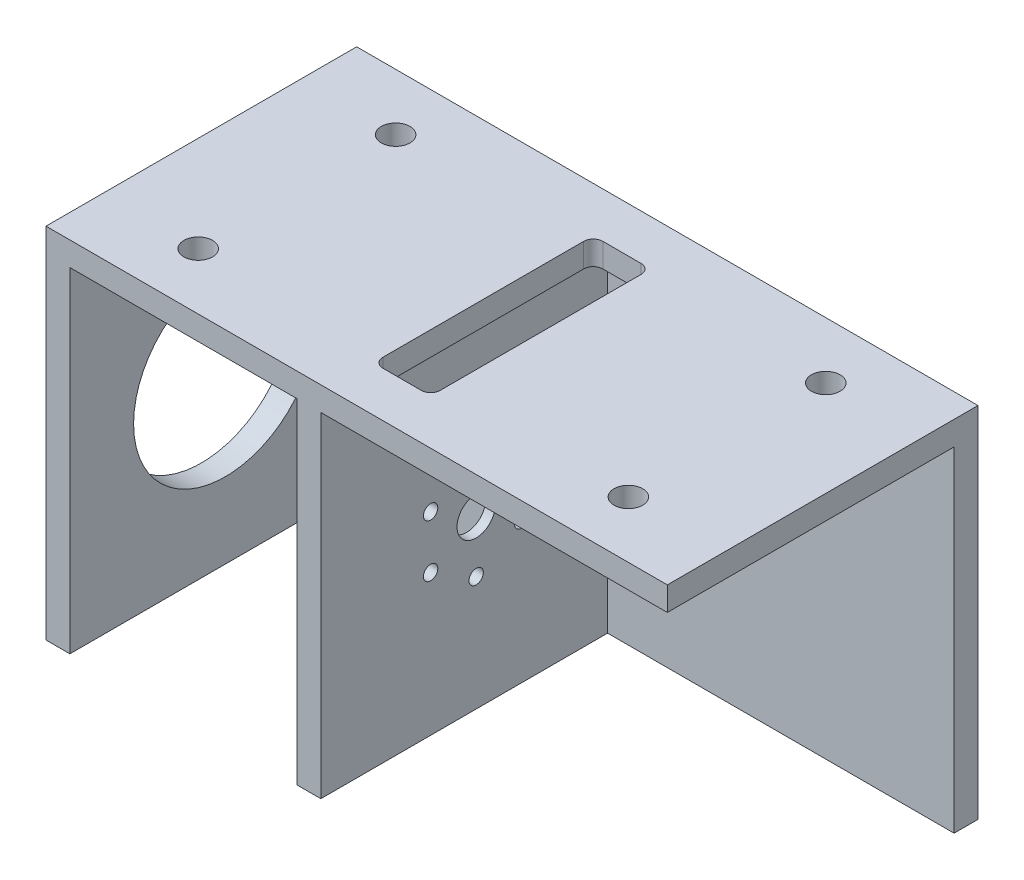
ISO-10303-21;
HEADER;
FILE_DESCRIPTION(('STEP AP214'),'2;1');
FILE_NAME('part.step','',(''),(''),'','','');
FILE_SCHEMA(('AUTOMOTIVE_DESIGN { 1 0 10303 214 1 1 1 1 }'));
ENDSEC;
DATA;
#1=APPLICATION_CONTEXT('core data for automotive mechanical design processes');
#2=APPLICATION_PROTOCOL_DEFINITION('international standard','automotive_design',2000,#1);
#3=PRODUCT_CONTEXT('',#1,'mechanical');
#4=PRODUCT('Part','Part','',(#3));
#5=PRODUCT_RELATED_PRODUCT_CATEGORY('part','',(#4));
#6=PRODUCT_DEFINITION_FORMATION('','',#4);
#7=PRODUCT_DEFINITION_CONTEXT('part definition',#1,'design');
#8=PRODUCT_DEFINITION('design','',#6,#7);
#9=PRODUCT_DEFINITION_SHAPE('','',#8);
#10=(LENGTH_UNIT() NAMED_UNIT(*) SI_UNIT(.MILLI.,.METRE.));
#11=(NAMED_UNIT(*) PLANE_ANGLE_UNIT() SI_UNIT($,.RADIAN.));
#12=(NAMED_UNIT(*) SI_UNIT($,.STERADIAN.) SOLID_ANGLE_UNIT());
#13=UNCERTAINTY_MEASURE_WITH_UNIT(LENGTH_MEASURE(1.E-05),#10,'distance_accuracy_value','');
#14=(GEOMETRIC_REPRESENTATION_CONTEXT(3) GLOBAL_UNCERTAINTY_ASSIGNED_CONTEXT((#13)) GLOBAL_UNIT_ASSIGNED_CONTEXT((#10,
#11,#12)) REPRESENTATION_CONTEXT('',''));
#15=CARTESIAN_POINT('',(0.,0.,0.));
#16=DIRECTION('',(0.,0.,1.));
#17=DIRECTION('',(1.,0.,0.));
#18=AXIS2_PLACEMENT_3D('',#15,#16,#17);
#19=CARTESIAN_POINT('',(0.,0.,0.));
#20=DIRECTION('',(0.,-1.,0.));
#21=DIRECTION('',(0.,0.,-1.));
#22=AXIS2_PLACEMENT_3D('',#19,#20,#21);
#23=PLANE('',#22);
#24=CARTESIAN_POINT('',(-45.,0.,-20.65));
#25=DIRECTION('',(0.,1.,0.));
#26=DIRECTION('',(0.,0.,1.));
#27=AXIS2_PLACEMENT_3D('',#24,#25,#26);
#28=CIRCLE('',#27,3.);
#29=CARTESIAN_POINT('',(-45.,0.,-17.65));
#30=VERTEX_POINT('',#29);
#31=EDGE_CURVE('E282',#30,#30,#28,.T.);
#32=ORIENTED_EDGE('',*,*,#31,.T.);
#33=EDGE_LOOP('',(#32));
#34=FACE_BOUND('',#33,.T.);
#35=CARTESIAN_POINT('',(-45.,0.,20.65));
#36=DIRECTION('',(0.,1.,0.));
#37=DIRECTION('',(0.,0.,-1.));
#38=AXIS2_PLACEMENT_3D('',#35,#36,#37);
#39=CIRCLE('',#38,2.99999999999999);
#40=CARTESIAN_POINT('',(-45.,0.,17.65));
#41=VERTEX_POINT('',#40);
#42=EDGE_CURVE('E274',#41,#41,#39,.T.);
#43=ORIENTED_EDGE('',*,*,#42,.T.);
#44=EDGE_LOOP('',(#43));
#45=FACE_BOUND('',#44,.T.);
#46=DIRECTION('',(1.,0.,0.));
#47=VECTOR('',#46,1.);
#48=CARTESIAN_POINT('',(65.,0.,32.5));
#49=LINE('',#48,#47);
#50=CARTESIAN_POINT('',(-60.,0.,32.5));
#51=VERTEX_POINT('',#50);
#52=CARTESIAN_POINT('',(-12.5,0.,32.5));
#53=VERTEX_POINT('',#52);
#54=EDGE_CURVE('E299',#51,#53,#49,.T.);
#55=ORIENTED_EDGE('',*,*,#54,.F.);
#56=DIRECTION('',(0.,0.,-1.));
#57=VECTOR('',#56,1.);
#58=CARTESIAN_POINT('',(-60.,0.,102.678344238091));
#59=LINE('',#58,#57);
#60=CARTESIAN_POINT('',(-60.,0.,-27.5));
#61=VERTEX_POINT('',#60);
#62=EDGE_CURVE('E192',#51,#61,#59,.T.);
#63=ORIENTED_EDGE('',*,*,#62,.T.);
#64=DIRECTION('',(-1.,0.,0.));
#65=VECTOR('',#64,1.);
#66=CARTESIAN_POINT('',(-65.,0.,-27.5));
#67=LINE('',#66,#65);
#68=CARTESIAN_POINT('',(-12.5,0.,-27.5));
#69=VERTEX_POINT('',#68);
#70=EDGE_CURVE('E200',#69,#61,#67,.T.);
#71=ORIENTED_EDGE('',*,*,#70,.F.);
#72=DIRECTION('',(0.,0.,-1.));
#73=VECTOR('',#72,1.);
#74=CARTESIAN_POINT('',(-12.5,0.,102.678344238091));
#75=LINE('',#74,#73);
#76=EDGE_CURVE('E420',#53,#69,#75,.T.);
#77=ORIENTED_EDGE('',*,*,#76,.F.);
#78=EDGE_LOOP('',(#55,#63,#71,#77));
#79=FACE_BOUND('',#78,.T.);
#80=ADVANCED_FACE('F45',(#34,#45,#79),#23,.T.);
#81=CARTESIAN_POINT('',(-65.,-70.,-27.5));
#82=DIRECTION('',(0.,0.,-1.));
#83=DIRECTION('',(-1.,0.,0.));
#84=AXIS2_PLACEMENT_3D('',#81,#82,#83);
#85=PLANE('',#84);
#86=DIRECTION('',(0.,1.,0.));
#87=VECTOR('',#86,1.);
#88=CARTESIAN_POINT('',(-60.,0.,-27.5));
#89=LINE('',#88,#87);
#90=CARTESIAN_POINT('',(-60.,-70.,-27.5));
#91=VERTEX_POINT('',#90);
#92=EDGE_CURVE('E185',#91,#61,#89,.T.);
#93=ORIENTED_EDGE('',*,*,#92,.F.);
#94=DIRECTION('',(-1.,0.,0.));
#95=VECTOR('',#94,1.);
#96=CARTESIAN_POINT('',(-65.,-70.,-27.5));
#97=LINE('',#96,#95);
#98=CARTESIAN_POINT('',(-12.5,-70.,-27.5));
#99=VERTEX_POINT('',#98);
#100=EDGE_CURVE('E198',#99,#91,#97,.T.);
#101=ORIENTED_EDGE('',*,*,#100,.F.);
#102=DIRECTION('',(0.,-1.,0.));
#103=VECTOR('',#102,1.);
#104=CARTESIAN_POINT('',(-12.5,0.,-27.5));
#105=LINE('',#104,#103);
#106=EDGE_CURVE('E63',#69,#99,#105,.T.);
#107=ORIENTED_EDGE('',*,*,#106,.F.);
#108=ORIENTED_EDGE('',*,*,#70,.T.);
#109=EDGE_LOOP('',(#93,#101,#107,#108));
#110=FACE_BOUND('',#109,.T.);
#111=ADVANCED_FACE('F197',(#110),#85,.F.);
#112=CARTESIAN_POINT('',(-2.5,-35.,0.));
#113=DIRECTION('',(-1.,0.,0.));
#114=DIRECTION('',(0.,0.,1.));
#115=AXIS2_PLACEMENT_3D('',#112,#113,#114);
#116=CYLINDRICAL_SURFACE('',#115,4.);
#117=CARTESIAN_POINT('',(-7.5,-35.,0.));
#118=DIRECTION('',(-1.,0.,0.));
#119=DIRECTION('',(0.,0.,1.));
#120=AXIS2_PLACEMENT_3D('',#117,#118,#119);
#121=CIRCLE('',#120,4.);
#122=CARTESIAN_POINT('',(-7.5,-35.,4.));
#123=VERTEX_POINT('',#122);
#124=EDGE_CURVE('E374',#123,#123,#121,.T.);
#125=ORIENTED_EDGE('',*,*,#124,.F.);
#126=EDGE_LOOP('',(#125));
#127=FACE_BOUND('',#126,.T.);
#128=CARTESIAN_POINT('',(-9.5,-35.,0.));
#129=DIRECTION('',(-1.,0.,0.));
#130=DIRECTION('',(0.,0.,1.));
#131=AXIS2_PLACEMENT_3D('',#128,#129,#130);
#132=CIRCLE('',#131,4.);
#133=CARTESIAN_POINT('',(-9.5,-35.,4.));
#134=VERTEX_POINT('',#133);
#135=EDGE_CURVE('E49',#134,#134,#132,.F.);
#136=ORIENTED_EDGE('',*,*,#135,.F.);
#137=EDGE_LOOP('',(#136));
#138=FACE_BOUND('',#137,.T.);
#139=ADVANCED_FACE('F532',(#127,#138),#116,.F.);
#140=CARTESIAN_POINT('',(45.,0.,20.65));
#141=DIRECTION('',(0.,1.,0.));
#142=DIRECTION('',(0.,0.,1.));
#143=AXIS2_PLACEMENT_3D('',#140,#141,#142);
#144=CIRCLE('',#143,2.99999999999999);
#145=CARTESIAN_POINT('',(45.,0.,23.65));
#146=VERTEX_POINT('',#145);
#147=EDGE_CURVE('E229',#146,#146,#144,.T.);
#148=ORIENTED_EDGE('',*,*,#147,.T.);
#149=EDGE_LOOP('',(#148));
#150=FACE_BOUND('',#149,.T.);
#151=CARTESIAN_POINT('',(45.,0.,-20.65));
#152=DIRECTION('',(0.,1.,0.));
#153=DIRECTION('',(0.,0.,-1.));
#154=AXIS2_PLACEMENT_3D('',#151,#152,#153);
#155=CIRCLE('',#154,3.);
#156=CARTESIAN_POINT('',(45.,0.,-23.65));
#157=VERTEX_POINT('',#156);
#158=EDGE_CURVE('E255',#157,#157,#155,.T.);
#159=ORIENTED_EDGE('',*,*,#158,.T.);
#160=EDGE_LOOP('',(#159));
#161=FACE_BOUND('',#160,.T.);
#162=DIRECTION('',(0.,0.,-1.));
#163=VECTOR('',#162,1.);
#164=CARTESIAN_POINT('',(5.99999999999999,0.,-23.));
#165=LINE('',#164,#163);
#166=CARTESIAN_POINT('',(5.99999999999999,0.,21.));
#167=VERTEX_POINT('',#166);
#168=CARTESIAN_POINT('',(5.99999999999999,0.,-21.));
#169=VERTEX_POINT('',#168);
#170=EDGE_CURVE('E263',#167,#169,#165,.T.);
#171=ORIENTED_EDGE('',*,*,#170,.T.);
#172=CARTESIAN_POINT('',(3.99999999999999,0.,-21.));
#173=DIRECTION('',(0.,-1.,0.));
#174=DIRECTION('',(0.,0.,-1.));
#175=AXIS2_PLACEMENT_3D('',#172,#173,#174);
#176=CIRCLE('',#175,2.);
#177=CARTESIAN_POINT('',(3.99999999999999,0.,-23.));
#178=VERTEX_POINT('',#177);
#179=EDGE_CURVE('E366',#169,#178,#176,.F.);
#180=ORIENTED_EDGE('',*,*,#179,.T.);
#181=DIRECTION('',(-1.,0.,0.));
#182=VECTOR('',#181,1.);
#183=CARTESIAN_POINT('',(5.99999999999999,0.,-23.));
#184=LINE('',#183,#182);
#185=CARTESIAN_POINT('',(-4.,0.,-23.));
#186=VERTEX_POINT('',#185);
#187=EDGE_CURVE('E243',#178,#186,#184,.T.);
#188=ORIENTED_EDGE('',*,*,#187,.T.);
#189=CARTESIAN_POINT('',(-4.,0.,-21.));
#190=DIRECTION('',(0.,-1.,0.));
#191=DIRECTION('',(0.,0.,-1.));
#192=AXIS2_PLACEMENT_3D('',#189,#190,#191);
#193=CIRCLE('',#192,2.);
#194=CARTESIAN_POINT('',(-6.,0.,-21.));
#195=VERTEX_POINT('',#194);
#196=EDGE_CURVE('E55',#186,#195,#193,.F.);
#197=ORIENTED_EDGE('',*,*,#196,.T.);
#198=DIRECTION('',(0.,0.,1.));
#199=VECTOR('',#198,1.);
#200=CARTESIAN_POINT('',(-6.,0.,-23.));
#201=LINE('',#200,#199);
#202=CARTESIAN_POINT('',(-6.,0.,21.));
#203=VERTEX_POINT('',#202);
#204=EDGE_CURVE('E234',#195,#203,#201,.T.);
#205=ORIENTED_EDGE('',*,*,#204,.T.);
#206=CARTESIAN_POINT('',(-4.,0.,21.));
#207=DIRECTION('',(0.,-1.,0.));
#208=DIRECTION('',(0.,0.,-1.));
#209=AXIS2_PLACEMENT_3D('',#206,#207,#208);
#210=CIRCLE('',#209,2.);
#211=CARTESIAN_POINT('',(-4.,0.,23.));
#212=VERTEX_POINT('',#211);
#213=EDGE_CURVE('E360',#203,#212,#210,.F.);
#214=ORIENTED_EDGE('',*,*,#213,.T.);
#215=DIRECTION('',(1.,0.,0.));
#216=VECTOR('',#215,1.);
#217=CARTESIAN_POINT('',(5.99999999999999,0.,23.));
#218=LINE('',#217,#216);
#219=CARTESIAN_POINT('',(3.99999999999999,0.,23.));
#220=VERTEX_POINT('',#219);
#221=EDGE_CURVE('E259',#212,#220,#218,.T.);
#222=ORIENTED_EDGE('',*,*,#221,.T.);
#223=CARTESIAN_POINT('',(3.99999999999999,0.,21.));
#224=DIRECTION('',(0.,-1.,0.));
#225=DIRECTION('',(0.,0.,-1.));
#226=AXIS2_PLACEMENT_3D('',#223,#224,#225);
#227=CIRCLE('',#226,2.);
#228=EDGE_CURVE('E354',#220,#167,#227,.F.);
#229=ORIENTED_EDGE('',*,*,#228,.T.);
#230=EDGE_LOOP('',(#171,#180,#188,#197,#205,#214,#222,#229));
#231=FACE_BOUND('',#230,.T.);
#232=CARTESIAN_POINT('',(-7.5,0.,32.5));
#233=VERTEX_POINT('',#232);
#234=CARTESIAN_POINT('',(65.,0.,32.5));
#235=VERTEX_POINT('',#234);
#236=EDGE_CURVE('E311',#233,#235,#49,.T.);
#237=ORIENTED_EDGE('',*,*,#236,.F.);
#238=DIRECTION('',(0.,0.,-1.));
#239=VECTOR('',#238,1.);
#240=CARTESIAN_POINT('',(-7.5,0.,102.678344238091));
#241=LINE('',#240,#239);
#242=CARTESIAN_POINT('',(-7.5,0.,-27.5));
#243=VERTEX_POINT('',#242);
#244=EDGE_CURVE('E423',#233,#243,#241,.T.);
#245=ORIENTED_EDGE('',*,*,#244,.T.);
#246=CARTESIAN_POINT('',(65.,0.,-27.5));
#247=VERTEX_POINT('',#246);
#248=EDGE_CURVE('E71',#247,#243,#67,.T.);
#249=ORIENTED_EDGE('',*,*,#248,.F.);
#250=DIRECTION('',(0.,0.,-1.));
#251=VECTOR('',#250,1.);
#252=CARTESIAN_POINT('',(65.,0.,-32.5));
#253=LINE('',#252,#251);
#254=EDGE_CURVE('E290',#235,#247,#253,.T.);
#255=ORIENTED_EDGE('',*,*,#254,.F.);
#256=EDGE_LOOP('',(#237,#245,#249,#255));
#257=FACE_BOUND('',#256,.T.);
#258=ADVANCED_FACE('F515',(#150,#161,#231,#257),#23,.T.);
#259=DIRECTION('',(0.,1.,0.));
#260=VECTOR('',#259,1.);
#261=CARTESIAN_POINT('',(-7.5,0.,-27.5));
#262=LINE('',#261,#260);
#263=CARTESIAN_POINT('',(-7.5,-70.,-27.5));
#264=VERTEX_POINT('',#263);
#265=EDGE_CURVE('E401',#264,#243,#262,.T.);
#266=ORIENTED_EDGE('',*,*,#265,.F.);
#267=CARTESIAN_POINT('',(65.,-70.,-27.5));
#268=VERTEX_POINT('',#267);
#269=EDGE_CURVE('E209',#268,#264,#97,.T.);
#270=ORIENTED_EDGE('',*,*,#269,.F.);
#271=DIRECTION('',(0.,1.,0.));
#272=VECTOR('',#271,1.);
#273=CARTESIAN_POINT('',(65.,-70.,-27.5));
#274=LINE('',#273,#272);
#275=EDGE_CURVE('E223',#268,#247,#274,.T.);
#276=ORIENTED_EDGE('',*,*,#275,.T.);
#277=ORIENTED_EDGE('',*,*,#248,.T.);
#278=EDGE_LOOP('',(#266,#270,#276,#277));
#279=FACE_BOUND('',#278,.T.);
#280=ADVANCED_FACE('F444',(#279),#85,.F.);
#281=CARTESIAN_POINT('',(0.,5.,0.));
#282=DIRECTION('',(0.,-1.,0.));
#283=DIRECTION('',(0.,0.,-1.));
#284=AXIS2_PLACEMENT_3D('',#281,#282,#283);
#285=PLANE('',#284);
#286=CARTESIAN_POINT('',(45.,5.,-20.65));
#287=DIRECTION('',(0.,1.,0.));
#288=DIRECTION('',(0.,0.,-1.));
#289=AXIS2_PLACEMENT_3D('',#286,#287,#288);
#290=CIRCLE('',#289,3.);
#291=CARTESIAN_POINT('',(45.,5.,-23.65));
#292=VERTEX_POINT('',#291);
#293=EDGE_CURVE('E270',#292,#292,#290,.T.);
#294=ORIENTED_EDGE('',*,*,#293,.F.);
#295=EDGE_LOOP('',(#294));
#296=FACE_BOUND('',#295,.T.);
#297=CARTESIAN_POINT('',(-45.,5.,20.65));
#298=DIRECTION('',(0.,1.,0.));
#299=DIRECTION('',(0.,0.,-1.));
#300=AXIS2_PLACEMENT_3D('',#297,#298,#299);
#301=CIRCLE('',#300,2.99999999999999);
#302=CARTESIAN_POINT('',(-45.,5.,17.65));
#303=VERTEX_POINT('',#302);
#304=EDGE_CURVE('E278',#303,#303,#301,.T.);
#305=ORIENTED_EDGE('',*,*,#304,.F.);
#306=EDGE_LOOP('',(#305));
#307=FACE_BOUND('',#306,.T.);
#308=CARTESIAN_POINT('',(-45.,5.,-20.65));
#309=DIRECTION('',(0.,1.,0.));
#310=DIRECTION('',(0.,0.,1.));
#311=AXIS2_PLACEMENT_3D('',#308,#309,#310);
#312=CIRCLE('',#311,3.);
#313=CARTESIAN_POINT('',(-45.,5.,-17.65));
#314=VERTEX_POINT('',#313);
#315=EDGE_CURVE('E286',#314,#314,#312,.T.);
#316=ORIENTED_EDGE('',*,*,#315,.F.);
#317=EDGE_LOOP('',(#316));
#318=FACE_BOUND('',#317,.T.);
#319=DIRECTION('',(0.,0.,-1.));
#320=VECTOR('',#319,1.);
#321=CARTESIAN_POINT('',(65.,5.,-32.5));
#322=LINE('',#321,#320);
#323=CARTESIAN_POINT('',(65.,5.,32.5));
#324=VERTEX_POINT('',#323);
#325=CARTESIAN_POINT('',(65.,5.,-32.5));
#326=VERTEX_POINT('',#325);
#327=EDGE_CURVE('E294',#324,#326,#322,.T.);
#328=ORIENTED_EDGE('',*,*,#327,.T.);
#329=DIRECTION('',(-1.,0.,0.));
#330=VECTOR('',#329,1.);
#331=CARTESIAN_POINT('',(65.,5.,-32.5));
#332=LINE('',#331,#330);
#333=CARTESIAN_POINT('',(-65.,5.,-32.5));
#334=VERTEX_POINT('',#333);
#335=EDGE_CURVE('E298',#326,#334,#332,.T.);
#336=ORIENTED_EDGE('',*,*,#335,.T.);
#337=DIRECTION('',(0.,0.,1.));
#338=VECTOR('',#337,1.);
#339=CARTESIAN_POINT('',(-65.,5.,-32.5));
#340=LINE('',#339,#338);
#341=CARTESIAN_POINT('',(-65.,5.,32.5));
#342=VERTEX_POINT('',#341);
#343=EDGE_CURVE('E302',#334,#342,#340,.T.);
#344=ORIENTED_EDGE('',*,*,#343,.T.);
#345=DIRECTION('',(1.,0.,0.));
#346=VECTOR('',#345,1.);
#347=CARTESIAN_POINT('',(65.,5.,32.5));
#348=LINE('',#347,#346);
#349=EDGE_CURVE('E305',#342,#324,#348,.T.);
#350=ORIENTED_EDGE('',*,*,#349,.T.);
#351=EDGE_LOOP('',(#328,#336,#344,#350));
#352=FACE_BOUND('',#351,.T.);
#353=DIRECTION('',(0.,0.,1.));
#354=VECTOR('',#353,1.);
#355=CARTESIAN_POINT('',(-6.,5.,-23.));
#356=LINE('',#355,#354);
#357=CARTESIAN_POINT('',(-6.,5.,-21.));
#358=VERTEX_POINT('',#357);
#359=CARTESIAN_POINT('',(-6.,5.,21.));
#360=VERTEX_POINT('',#359);
#361=EDGE_CURVE('E238',#358,#360,#356,.T.);
#362=ORIENTED_EDGE('',*,*,#361,.F.);
#363=CARTESIAN_POINT('',(-4.,5.,-21.));
#364=DIRECTION('',(0.,-1.,0.));
#365=DIRECTION('',(0.,0.,-1.));
#366=AXIS2_PLACEMENT_3D('',#363,#364,#365);
#367=CIRCLE('',#366,2.);
#368=CARTESIAN_POINT('',(-4.,5.,-23.));
#369=VERTEX_POINT('',#368);
#370=EDGE_CURVE('E11',#358,#369,#367,.T.);
#371=ORIENTED_EDGE('',*,*,#370,.T.);
#372=DIRECTION('',(-1.,0.,0.));
#373=VECTOR('',#372,1.);
#374=CARTESIAN_POINT('',(5.99999999999999,5.,-23.));
#375=LINE('',#374,#373);
#376=CARTESIAN_POINT('',(3.99999999999999,5.,-23.));
#377=VERTEX_POINT('',#376);
#378=EDGE_CURVE('E251',#377,#369,#375,.T.);
#379=ORIENTED_EDGE('',*,*,#378,.F.);
#380=CARTESIAN_POINT('',(3.99999999999999,5.,-21.));
#381=DIRECTION('',(0.,-1.,0.));
#382=DIRECTION('',(0.,0.,-1.));
#383=AXIS2_PLACEMENT_3D('',#380,#381,#382);
#384=CIRCLE('',#383,2.);
#385=CARTESIAN_POINT('',(5.99999999999999,5.,-21.));
#386=VERTEX_POINT('',#385);
#387=EDGE_CURVE('E369',#377,#386,#384,.T.);
#388=ORIENTED_EDGE('',*,*,#387,.T.);
#389=DIRECTION('',(0.,0.,-1.));
#390=VECTOR('',#389,1.);
#391=CARTESIAN_POINT('',(5.99999999999999,5.,-23.));
#392=LINE('',#391,#390);
#393=CARTESIAN_POINT('',(5.99999999999999,5.,21.));
#394=VERTEX_POINT('',#393);
#395=EDGE_CURVE('E247',#394,#386,#392,.T.);
#396=ORIENTED_EDGE('',*,*,#395,.F.);
#397=CARTESIAN_POINT('',(3.99999999999999,5.,21.));
#398=DIRECTION('',(0.,-1.,0.));
#399=DIRECTION('',(0.,0.,-1.));
#400=AXIS2_PLACEMENT_3D('',#397,#398,#399);
#401=CIRCLE('',#400,2.);
#402=CARTESIAN_POINT('',(3.99999999999999,5.,23.));
#403=VERTEX_POINT('',#402);
#404=EDGE_CURVE('E357',#394,#403,#401,.T.);
#405=ORIENTED_EDGE('',*,*,#404,.T.);
#406=DIRECTION('',(1.,0.,0.));
#407=VECTOR('',#406,1.);
#408=CARTESIAN_POINT('',(5.99999999999999,5.,23.));
#409=LINE('',#408,#407);
#410=CARTESIAN_POINT('',(-4.,5.,23.));
#411=VERTEX_POINT('',#410);
#412=EDGE_CURVE('E242',#411,#403,#409,.T.);
#413=ORIENTED_EDGE('',*,*,#412,.F.);
#414=CARTESIAN_POINT('',(-4.,5.,21.));
#415=DIRECTION('',(0.,-1.,0.));
#416=DIRECTION('',(0.,0.,-1.));
#417=AXIS2_PLACEMENT_3D('',#414,#415,#416);
#418=CIRCLE('',#417,2.);
#419=EDGE_CURVE('E363',#411,#360,#418,.T.);
#420=ORIENTED_EDGE('',*,*,#419,.T.);
#421=EDGE_LOOP('',(#362,#371,#379,#388,#396,#405,#413,#420));
#422=FACE_BOUND('',#421,.T.);
#423=CARTESIAN_POINT('',(45.,5.,20.65));
#424=DIRECTION('',(0.,1.,0.));
#425=DIRECTION('',(0.,0.,1.));
#426=AXIS2_PLACEMENT_3D('',#423,#424,#425);
#427=CIRCLE('',#426,2.99999999999999);
#428=CARTESIAN_POINT('',(45.,5.,23.65));
#429=VERTEX_POINT('',#428);
#430=EDGE_CURVE('E230',#429,#429,#427,.T.);
#431=ORIENTED_EDGE('',*,*,#430,.F.);
#432=EDGE_LOOP('',(#431));
#433=FACE_BOUND('',#432,.T.);
#434=ADVANCED_FACE('F512',(#296,#307,#318,#352,#422,#433),#285,.F.);
#435=CARTESIAN_POINT('',(65.,5.,-32.5));
#436=DIRECTION('',(-1.,0.,0.));
#437=DIRECTION('',(0.,0.,1.));
#438=AXIS2_PLACEMENT_3D('',#435,#436,#437);
#439=PLANE('',#438);
#440=ORIENTED_EDGE('',*,*,#254,.T.);
#441=ORIENTED_EDGE('',*,*,#275,.F.);
#442=DIRECTION('',(0.,0.,1.));
#443=VECTOR('',#442,1.);
#444=CARTESIAN_POINT('',(65.,-70.,-27.5));
#445=LINE('',#444,#443);
#446=CARTESIAN_POINT('',(65.,-70.,-32.5));
#447=VERTEX_POINT('',#446);
#448=EDGE_CURVE('E210',#447,#268,#445,.T.);
#449=ORIENTED_EDGE('',*,*,#448,.F.);
#450=DIRECTION('',(0.,-1.,0.));
#451=VECTOR('',#450,1.);
#452=CARTESIAN_POINT('',(65.,5.,-32.5));
#453=LINE('',#452,#451);
#454=EDGE_CURVE('E323',#326,#447,#453,.T.);
#455=ORIENTED_EDGE('',*,*,#454,.F.);
#456=ORIENTED_EDGE('',*,*,#327,.F.);
#457=DIRECTION('',(0.,-1.,0.));
#458=VECTOR('',#457,1.);
#459=CARTESIAN_POINT('',(65.,5.,32.5));
#460=LINE('',#459,#458);
#461=EDGE_CURVE('E308',#324,#235,#460,.T.);
#462=ORIENTED_EDGE('',*,*,#461,.T.);
#463=EDGE_LOOP('',(#440,#441,#449,#455,#456,#462));
#464=FACE_BOUND('',#463,.T.);
#465=ADVANCED_FACE('F441',(#464),#439,.F.);
#466=CARTESIAN_POINT('',(65.,5.,-32.5));
#467=DIRECTION('',(0.,0.,1.));
#468=DIRECTION('',(1.,0.,0.));
#469=AXIS2_PLACEMENT_3D('',#466,#467,#468);
#470=PLANE('',#469);
#471=ORIENTED_EDGE('',*,*,#454,.T.);
#472=DIRECTION('',(1.,0.,0.));
#473=VECTOR('',#472,1.);
#474=CARTESIAN_POINT('',(65.,-70.,-32.5));
#475=LINE('',#474,#473);
#476=CARTESIAN_POINT('',(-65.,-70.,-32.5));
#477=VERTEX_POINT('',#476);
#478=EDGE_CURVE('E216',#477,#447,#475,.T.);
#479=ORIENTED_EDGE('',*,*,#478,.F.);
#480=DIRECTION('',(0.,-1.,0.));
#481=VECTOR('',#480,1.);
#482=CARTESIAN_POINT('',(-65.,5.,-32.5));
#483=LINE('',#482,#481);
#484=EDGE_CURVE('E320',#334,#477,#483,.T.);
#485=ORIENTED_EDGE('',*,*,#484,.F.);
#486=ORIENTED_EDGE('',*,*,#335,.F.);
#487=EDGE_LOOP('',(#471,#479,#485,#486));
#488=FACE_BOUND('',#487,.T.);
#489=ADVANCED_FACE('F436',(#488),#470,.F.);
#490=CARTESIAN_POINT('',(-65.,5.,-32.5));
#491=DIRECTION('',(1.,0.,0.));
#492=DIRECTION('',(0.,0.,-1.));
#493=AXIS2_PLACEMENT_3D('',#490,#491,#492);
#494=PLANE('',#493);
#495=CARTESIAN_POINT('',(-65.,-35.,0.));
#496=DIRECTION('',(-1.,0.,0.));
#497=DIRECTION('',(0.,0.,1.));
#498=AXIS2_PLACEMENT_3D('',#495,#496,#497);
#499=CIRCLE('',#498,19.175);
#500=CARTESIAN_POINT('',(-65.,-35.,19.175));
#501=VERTEX_POINT('',#500);
#502=EDGE_CURVE('E497',#501,#501,#499,.T.);
#503=ORIENTED_EDGE('',*,*,#502,.F.);
#504=EDGE_LOOP('',(#503));
#505=FACE_BOUND('',#504,.T.);
#506=ORIENTED_EDGE('',*,*,#484,.T.);
#507=DIRECTION('',(0.,0.,-1.));
#508=VECTOR('',#507,1.);
#509=CARTESIAN_POINT('',(-65.,-70.,-32.5));
#510=LINE('',#509,#508);
#511=CARTESIAN_POINT('',(-65.,-70.,32.5));
#512=VERTEX_POINT('',#511);
#513=EDGE_CURVE('E215',#512,#477,#510,.T.);
#514=ORIENTED_EDGE('',*,*,#513,.F.);
#515=DIRECTION('',(0.,-1.,0.));
#516=VECTOR('',#515,1.);
#517=CARTESIAN_POINT('',(-65.,5.,32.5));
#518=LINE('',#517,#516);
#519=EDGE_CURVE('E317',#342,#512,#518,.T.);
#520=ORIENTED_EDGE('',*,*,#519,.F.);
#521=ORIENTED_EDGE('',*,*,#343,.F.);
#522=EDGE_LOOP('',(#506,#514,#520,#521));
#523=FACE_BOUND('',#522,.T.);
#524=ADVANCED_FACE('F504',(#505,#523),#494,.F.);
#525=CARTESIAN_POINT('',(65.,5.,32.5));
#526=DIRECTION('',(0.,0.,-1.));
#527=DIRECTION('',(-1.,0.,0.));
#528=AXIS2_PLACEMENT_3D('',#525,#526,#527);
#529=PLANE('',#528);
#530=ORIENTED_EDGE('',*,*,#519,.T.);
#531=DIRECTION('',(-1.,0.,0.));
#532=VECTOR('',#531,1.);
#533=CARTESIAN_POINT('',(-65.,-70.,32.5));
#534=LINE('',#533,#532);
#535=CARTESIAN_POINT('',(-60.,-70.,32.5));
#536=VERTEX_POINT('',#535);
#537=EDGE_CURVE('E484',#536,#512,#534,.T.);
#538=ORIENTED_EDGE('',*,*,#537,.F.);
#539=DIRECTION('',(0.,-1.,0.));
#540=VECTOR('',#539,1.);
#541=CARTESIAN_POINT('',(-60.,0.,32.5));
#542=LINE('',#541,#540);
#543=EDGE_CURVE('E187',#51,#536,#542,.T.);
#544=ORIENTED_EDGE('',*,*,#543,.F.);
#545=ORIENTED_EDGE('',*,*,#54,.T.);
#546=DIRECTION('',(0.,1.,0.));
#547=VECTOR('',#546,1.);
#548=CARTESIAN_POINT('',(-12.5,0.,32.5));
#549=LINE('',#548,#547);
#550=CARTESIAN_POINT('',(-12.5,-70.,32.5));
#551=VERTEX_POINT('',#550);
#552=EDGE_CURVE('E428',#551,#53,#549,.T.);
#553=ORIENTED_EDGE('',*,*,#552,.F.);
#554=DIRECTION('',(-1.,0.,0.));
#555=VECTOR('',#554,1.);
#556=CARTESIAN_POINT('',(-12.5,-70.,32.5));
#557=LINE('',#556,#555);
#558=CARTESIAN_POINT('',(-7.5,-70.,32.5));
#559=VERTEX_POINT('',#558);
#560=EDGE_CURVE('E426',#559,#551,#557,.T.);
#561=ORIENTED_EDGE('',*,*,#560,.F.);
#562=DIRECTION('',(0.,-1.,0.));
#563=VECTOR('',#562,1.);
#564=CARTESIAN_POINT('',(-7.5,0.,32.5));
#565=LINE('',#564,#563);
#566=EDGE_CURVE('E413',#233,#559,#565,.T.);
#567=ORIENTED_EDGE('',*,*,#566,.F.);
#568=ORIENTED_EDGE('',*,*,#236,.T.);
#569=ORIENTED_EDGE('',*,*,#461,.F.);
#570=ORIENTED_EDGE('',*,*,#349,.F.);
#571=EDGE_LOOP('',(#530,#538,#544,#545,#553,#561,#567,#568,#569,#570));
#572=FACE_BOUND('',#571,.T.);
#573=ADVANCED_FACE('F507',(#572),#529,.F.);
#574=CARTESIAN_POINT('',(-45.,5.,-20.65));
#575=DIRECTION('',(0.,-1.,0.));
#576=DIRECTION('',(0.,0.,-1.));
#577=AXIS2_PLACEMENT_3D('',#574,#575,#576);
#578=CYLINDRICAL_SURFACE('',#577,3.);
#579=ORIENTED_EDGE('',*,*,#315,.T.);
#580=EDGE_LOOP('',(#579));
#581=FACE_BOUND('',#580,.T.);
#582=ORIENTED_EDGE('',*,*,#31,.F.);
#583=EDGE_LOOP('',(#582));
#584=FACE_BOUND('',#583,.T.);
#585=ADVANCED_FACE('F518',(#581,#584),#578,.F.);
#586=CARTESIAN_POINT('',(-45.,5.,20.65));
#587=DIRECTION('',(0.,-1.,0.));
#588=DIRECTION('',(0.,0.,-1.));
#589=AXIS2_PLACEMENT_3D('',#586,#587,#588);
#590=CYLINDRICAL_SURFACE('',#589,2.99999999999999);
#591=ORIENTED_EDGE('',*,*,#304,.T.);
#592=EDGE_LOOP('',(#591));
#593=FACE_BOUND('',#592,.T.);
#594=ORIENTED_EDGE('',*,*,#42,.F.);
#595=EDGE_LOOP('',(#594));
#596=FACE_BOUND('',#595,.T.);
#597=ADVANCED_FACE('F523',(#593,#596),#590,.F.);
#598=CARTESIAN_POINT('',(45.,5.,-20.65));
#599=DIRECTION('',(0.,-1.,0.));
#600=DIRECTION('',(0.,0.,-1.));
#601=AXIS2_PLACEMENT_3D('',#598,#599,#600);
#602=CYLINDRICAL_SURFACE('',#601,3.);
#603=ORIENTED_EDGE('',*,*,#293,.T.);
#604=EDGE_LOOP('',(#603));
#605=FACE_BOUND('',#604,.T.);
#606=ORIENTED_EDGE('',*,*,#158,.F.);
#607=EDGE_LOOP('',(#606));
#608=FACE_BOUND('',#607,.T.);
#609=ADVANCED_FACE('F837',(#605,#608),#602,.F.);
#610=CARTESIAN_POINT('',(-6.,5.,-23.));
#611=DIRECTION('',(1.,0.,0.));
#612=DIRECTION('',(0.,0.,-1.));
#613=AXIS2_PLACEMENT_3D('',#610,#611,#612);
#614=PLANE('',#613);
#615=ORIENTED_EDGE('',*,*,#361,.T.);
#616=DIRECTION('',(0.,-1.,0.));
#617=VECTOR('',#616,1.);
#618=CARTESIAN_POINT('',(-6.,0.,21.));
#619=LINE('',#618,#617);
#620=EDGE_CURVE('E343',#360,#203,#619,.T.);
#621=ORIENTED_EDGE('',*,*,#620,.T.);
#622=ORIENTED_EDGE('',*,*,#204,.F.);
#623=DIRECTION('',(0.,-1.,0.));
#624=VECTOR('',#623,1.);
#625=CARTESIAN_POINT('',(-6.,5.,-21.));
#626=LINE('',#625,#624);
#627=EDGE_CURVE('E340',#195,#358,#626,.F.);
#628=ORIENTED_EDGE('',*,*,#627,.T.);
#629=EDGE_LOOP('',(#615,#621,#622,#628));
#630=FACE_BOUND('',#629,.T.);
#631=ADVANCED_FACE('F572',(#630),#614,.T.);
#632=CARTESIAN_POINT('',(5.99999999999999,5.,23.));
#633=DIRECTION('',(0.,0.,-1.));
#634=DIRECTION('',(-1.,0.,0.));
#635=AXIS2_PLACEMENT_3D('',#632,#633,#634);
#636=PLANE('',#635);
#637=ORIENTED_EDGE('',*,*,#412,.T.);
#638=DIRECTION('',(0.,-1.,0.));
#639=VECTOR('',#638,1.);
#640=CARTESIAN_POINT('',(3.99999999999999,0.,23.));
#641=LINE('',#640,#639);
#642=EDGE_CURVE('E329',#403,#220,#641,.T.);
#643=ORIENTED_EDGE('',*,*,#642,.T.);
#644=ORIENTED_EDGE('',*,*,#221,.F.);
#645=DIRECTION('',(0.,-1.,0.));
#646=VECTOR('',#645,1.);
#647=CARTESIAN_POINT('',(-4.,5.,23.));
#648=LINE('',#647,#646);
#649=EDGE_CURVE('E326',#212,#411,#648,.F.);
#650=ORIENTED_EDGE('',*,*,#649,.T.);
#651=EDGE_LOOP('',(#637,#643,#644,#650));
#652=FACE_BOUND('',#651,.T.);
#653=ADVANCED_FACE('F564',(#652),#636,.T.);
#654=CARTESIAN_POINT('',(5.99999999999999,5.,-23.));
#655=DIRECTION('',(-1.,0.,0.));
#656=DIRECTION('',(0.,0.,1.));
#657=AXIS2_PLACEMENT_3D('',#654,#655,#656);
#658=PLANE('',#657);
#659=ORIENTED_EDGE('',*,*,#170,.F.);
#660=DIRECTION('',(0.,-1.,0.));
#661=VECTOR('',#660,1.);
#662=CARTESIAN_POINT('',(5.99999999999999,5.,21.));
#663=LINE('',#662,#661);
#664=EDGE_CURVE('E337',#167,#394,#663,.F.);
#665=ORIENTED_EDGE('',*,*,#664,.T.);
#666=ORIENTED_EDGE('',*,*,#395,.T.);
#667=DIRECTION('',(0.,-1.,0.));
#668=VECTOR('',#667,1.);
#669=CARTESIAN_POINT('',(5.99999999999999,0.,-21.));
#670=LINE('',#669,#668);
#671=EDGE_CURVE('E333',#386,#169,#670,.T.);
#672=ORIENTED_EDGE('',*,*,#671,.T.);
#673=EDGE_LOOP('',(#659,#665,#666,#672));
#674=FACE_BOUND('',#673,.T.);
#675=ADVANCED_FACE('F552',(#674),#658,.T.);
#676=CARTESIAN_POINT('',(5.99999999999999,5.,-23.));
#677=DIRECTION('',(0.,0.,1.));
#678=DIRECTION('',(1.,0.,0.));
#679=AXIS2_PLACEMENT_3D('',#676,#677,#678);
#680=PLANE('',#679);
#681=ORIENTED_EDGE('',*,*,#187,.F.);
#682=DIRECTION('',(0.,-1.,0.));
#683=VECTOR('',#682,1.);
#684=CARTESIAN_POINT('',(3.99999999999999,5.,-23.));
#685=LINE('',#684,#683);
#686=EDGE_CURVE('E351',#178,#377,#685,.F.);
#687=ORIENTED_EDGE('',*,*,#686,.T.);
#688=ORIENTED_EDGE('',*,*,#378,.T.);
#689=DIRECTION('',(0.,-1.,0.));
#690=VECTOR('',#689,1.);
#691=CARTESIAN_POINT('',(-4.,0.,-23.));
#692=LINE('',#691,#690);
#693=EDGE_CURVE('E347',#369,#186,#692,.T.);
#694=ORIENTED_EDGE('',*,*,#693,.T.);
#695=EDGE_LOOP('',(#681,#687,#688,#694));
#696=FACE_BOUND('',#695,.T.);
#697=ADVANCED_FACE('F580',(#696),#680,.T.);
#698=CARTESIAN_POINT('',(45.,5.,20.65));
#699=DIRECTION('',(0.,-1.,0.));
#700=DIRECTION('',(0.,0.,-1.));
#701=AXIS2_PLACEMENT_3D('',#698,#699,#700);
#702=CYLINDRICAL_SURFACE('',#701,2.99999999999999);
#703=ORIENTED_EDGE('',*,*,#430,.T.);
#704=EDGE_LOOP('',(#703));
#705=FACE_BOUND('',#704,.T.);
#706=ORIENTED_EDGE('',*,*,#147,.F.);
#707=EDGE_LOOP('',(#706));
#708=FACE_BOUND('',#707,.T.);
#709=ADVANCED_FACE('F593',(#705,#708),#702,.F.);
#710=CARTESIAN_POINT('',(3.99999999999999,5.,21.));
#711=DIRECTION('',(0.,1.,0.));
#712=DIRECTION('',(0.,0.,1.));
#713=AXIS2_PLACEMENT_3D('',#710,#711,#712);
#714=CYLINDRICAL_SURFACE('',#713,2.);
#715=ORIENTED_EDGE('',*,*,#404,.F.);
#716=ORIENTED_EDGE('',*,*,#664,.F.);
#717=ORIENTED_EDGE('',*,*,#228,.F.);
#718=ORIENTED_EDGE('',*,*,#642,.F.);
#719=EDGE_LOOP('',(#715,#716,#717,#718));
#720=FACE_BOUND('',#719,.T.);
#721=ADVANCED_FACE('F557',(#720),#714,.F.);
#722=CARTESIAN_POINT('',(-4.,5.,21.));
#723=DIRECTION('',(0.,1.,0.));
#724=DIRECTION('',(0.,0.,1.));
#725=AXIS2_PLACEMENT_3D('',#722,#723,#724);
#726=CYLINDRICAL_SURFACE('',#725,2.);
#727=ORIENTED_EDGE('',*,*,#419,.F.);
#728=ORIENTED_EDGE('',*,*,#649,.F.);
#729=ORIENTED_EDGE('',*,*,#213,.F.);
#730=ORIENTED_EDGE('',*,*,#620,.F.);
#731=EDGE_LOOP('',(#727,#728,#729,#730));
#732=FACE_BOUND('',#731,.T.);
#733=ADVANCED_FACE('F568',(#732),#726,.F.);
#734=CARTESIAN_POINT('',(3.99999999999999,5.,-21.));
#735=DIRECTION('',(0.,1.,0.));
#736=DIRECTION('',(0.,0.,1.));
#737=AXIS2_PLACEMENT_3D('',#734,#735,#736);
#738=CYLINDRICAL_SURFACE('',#737,2.);
#739=ORIENTED_EDGE('',*,*,#387,.F.);
#740=ORIENTED_EDGE('',*,*,#686,.F.);
#741=ORIENTED_EDGE('',*,*,#179,.F.);
#742=ORIENTED_EDGE('',*,*,#671,.F.);
#743=EDGE_LOOP('',(#739,#740,#741,#742));
#744=FACE_BOUND('',#743,.T.);
#745=ADVANCED_FACE('F583',(#744),#738,.F.);
#746=CARTESIAN_POINT('',(-4.,5.,-21.));
#747=DIRECTION('',(0.,1.,0.));
#748=DIRECTION('',(0.,0.,1.));
#749=AXIS2_PLACEMENT_3D('',#746,#747,#748);
#750=CYLINDRICAL_SURFACE('',#749,2.);
#751=ORIENTED_EDGE('',*,*,#370,.F.);
#752=ORIENTED_EDGE('',*,*,#627,.F.);
#753=ORIENTED_EDGE('',*,*,#196,.F.);
#754=ORIENTED_EDGE('',*,*,#693,.F.);
#755=EDGE_LOOP('',(#751,#752,#753,#754));
#756=FACE_BOUND('',#755,.T.);
#757=ADVANCED_FACE('F47',(#756),#750,.F.);
#758=CARTESIAN_POINT('',(0.,-70.,0.));
#759=DIRECTION('',(0.,1.,0.));
#760=DIRECTION('',(0.,0.,1.));
#761=AXIS2_PLACEMENT_3D('',#758,#759,#760);
#762=PLANE('',#761);
#763=ORIENTED_EDGE('',*,*,#478,.T.);
#764=ORIENTED_EDGE('',*,*,#448,.T.);
#765=ORIENTED_EDGE('',*,*,#269,.T.);
#766=DIRECTION('',(0.,0.,-1.));
#767=VECTOR('',#766,1.);
#768=CARTESIAN_POINT('',(-7.5,-70.,102.678344238091));
#769=LINE('',#768,#767);
#770=EDGE_CURVE('E410',#559,#264,#769,.T.);
#771=ORIENTED_EDGE('',*,*,#770,.F.);
#772=ORIENTED_EDGE('',*,*,#560,.T.);
#773=DIRECTION('',(0.,0.,-1.));
#774=VECTOR('',#773,1.);
#775=CARTESIAN_POINT('',(-12.5,-70.,102.678344238091));
#776=LINE('',#775,#774);
#777=EDGE_CURVE('E207',#551,#99,#776,.T.);
#778=ORIENTED_EDGE('',*,*,#777,.T.);
#779=ORIENTED_EDGE('',*,*,#100,.T.);
#780=DIRECTION('',(0.,0.,-1.));
#781=VECTOR('',#780,1.);
#782=CARTESIAN_POINT('',(-60.,-70.,102.678344238091));
#783=LINE('',#782,#781);
#784=EDGE_CURVE('E181',#536,#91,#783,.T.);
#785=ORIENTED_EDGE('',*,*,#784,.F.);
#786=ORIENTED_EDGE('',*,*,#537,.T.);
#787=ORIENTED_EDGE('',*,*,#513,.T.);
#788=EDGE_LOOP('',(#763,#764,#765,#771,#772,#778,#779,#785,#786,#787));
#789=FACE_BOUND('',#788,.T.);
#790=ADVANCED_FACE('F205',(#789),#762,.F.);
#791=CARTESIAN_POINT('',(-12.5,0.,102.678344238091));
#792=DIRECTION('',(1.,0.,0.));
#793=DIRECTION('',(0.,0.,-1.));
#794=AXIS2_PLACEMENT_3D('',#791,#792,#793);
#795=PLANE('',#794);
#796=CARTESIAN_POINT('',(-12.5,-35.,0.));
#797=DIRECTION('',(-1.,0.,0.));
#798=DIRECTION('',(0.,0.,1.));
#799=AXIS2_PLACEMENT_3D('',#796,#797,#798);
#800=CIRCLE('',#799,8.5);
#801=CARTESIAN_POINT('',(-12.5,-35.,8.5));
#802=VERTEX_POINT('',#801);
#803=EDGE_CURVE('E479',#802,#802,#800,.T.);
#804=ORIENTED_EDGE('',*,*,#803,.F.);
#805=EDGE_LOOP('',(#804));
#806=FACE_BOUND('',#805,.T.);
#807=CARTESIAN_POINT('',(-12.5,-29.5,9.52627944162882));
#808=DIRECTION('',(-1.,0.,0.));
#809=DIRECTION('',(0.,0.,1.));
#810=AXIS2_PLACEMENT_3D('',#807,#808,#809);
#811=CIRCLE('',#810,1.5);
#812=CARTESIAN_POINT('',(-12.5,-29.5,11.0262794416288));
#813=VERTEX_POINT('',#812);
#814=EDGE_CURVE('E456',#813,#813,#811,.T.);
#815=ORIENTED_EDGE('',*,*,#814,.F.);
#816=EDGE_LOOP('',(#815));
#817=FACE_BOUND('',#816,.T.);
#818=CARTESIAN_POINT('',(-12.5,-40.5,9.52627944162882));
#819=DIRECTION('',(-1.,0.,0.));
#820=DIRECTION('',(0.,0.,1.));
#821=AXIS2_PLACEMENT_3D('',#818,#819,#820);
#822=CIRCLE('',#821,1.5);
#823=CARTESIAN_POINT('',(-12.5,-40.5,11.0262794416288));
#824=VERTEX_POINT('',#823);
#825=EDGE_CURVE('E460',#824,#824,#822,.T.);
#826=ORIENTED_EDGE('',*,*,#825,.F.);
#827=EDGE_LOOP('',(#826));
#828=FACE_BOUND('',#827,.T.);
#829=CARTESIAN_POINT('',(-12.5,-46.,0.));
#830=DIRECTION('',(-1.,0.,0.));
#831=DIRECTION('',(0.,0.,1.));
#832=AXIS2_PLACEMENT_3D('',#829,#830,#831);
#833=CIRCLE('',#832,1.5);
#834=CARTESIAN_POINT('',(-12.5,-46.,1.5));
#835=VERTEX_POINT('',#834);
#836=EDGE_CURVE('E464',#835,#835,#833,.T.);
#837=ORIENTED_EDGE('',*,*,#836,.F.);
#838=EDGE_LOOP('',(#837));
#839=FACE_BOUND('',#838,.T.);
#840=CARTESIAN_POINT('',(-12.5,-40.5,-9.52627944162883));
#841=DIRECTION('',(-1.,0.,0.));
#842=DIRECTION('',(0.,0.,1.));
#843=AXIS2_PLACEMENT_3D('',#840,#841,#842);
#844=CIRCLE('',#843,1.5);
#845=CARTESIAN_POINT('',(-12.5,-40.5,-8.02627944162882));
#846=VERTEX_POINT('',#845);
#847=EDGE_CURVE('E468',#846,#846,#844,.T.);
#848=ORIENTED_EDGE('',*,*,#847,.F.);
#849=EDGE_LOOP('',(#848));
#850=FACE_BOUND('',#849,.T.);
#851=CARTESIAN_POINT('',(-12.5,-29.5,-9.52627944162883));
#852=DIRECTION('',(-1.,0.,0.));
#853=DIRECTION('',(0.,0.,1.));
#854=AXIS2_PLACEMENT_3D('',#851,#852,#853);
#855=CIRCLE('',#854,1.5);
#856=CARTESIAN_POINT('',(-12.5,-29.5,-8.02627944162883));
#857=VERTEX_POINT('',#856);
#858=EDGE_CURVE('E472',#857,#857,#855,.T.);
#859=ORIENTED_EDGE('',*,*,#858,.F.);
#860=EDGE_LOOP('',(#859));
#861=FACE_BOUND('',#860,.T.);
#862=CARTESIAN_POINT('',(-12.5,-24.,0.));
#863=DIRECTION('',(-1.,0.,0.));
#864=DIRECTION('',(0.,0.,1.));
#865=AXIS2_PLACEMENT_3D('',#862,#863,#864);
#866=CIRCLE('',#865,1.5);
#867=CARTESIAN_POINT('',(-12.5,-24.,1.5));
#868=VERTEX_POINT('',#867);
#869=EDGE_CURVE('E379',#868,#868,#866,.T.);
#870=ORIENTED_EDGE('',*,*,#869,.F.);
#871=EDGE_LOOP('',(#870));
#872=FACE_BOUND('',#871,.T.);
#873=ORIENTED_EDGE('',*,*,#777,.F.);
#874=ORIENTED_EDGE('',*,*,#552,.T.);
#875=ORIENTED_EDGE('',*,*,#76,.T.);
#876=ORIENTED_EDGE('',*,*,#106,.T.);
#877=EDGE_LOOP('',(#873,#874,#875,#876));
#878=FACE_BOUND('',#877,.T.);
#879=ADVANCED_FACE('F742',(#806,#817,#828,#839,#850,#861,#872,#878),#795,.F.);
#880=CARTESIAN_POINT('',(-7.5,0.,102.678344238091));
#881=DIRECTION('',(-1.,0.,0.));
#882=DIRECTION('',(0.,0.,1.));
#883=AXIS2_PLACEMENT_3D('',#880,#881,#882);
#884=PLANE('',#883);
#885=CARTESIAN_POINT('',(-7.5,-29.5,9.52627944162882));
#886=DIRECTION('',(-1.,0.,0.));
#887=DIRECTION('',(0.,0.,1.));
#888=AXIS2_PLACEMENT_3D('',#885,#886,#887);
#889=CIRCLE('',#888,1.5);
#890=CARTESIAN_POINT('',(-7.5,-29.5,11.0262794416288));
#891=VERTEX_POINT('',#890);
#892=EDGE_CURVE('E398',#891,#891,#889,.T.);
#893=ORIENTED_EDGE('',*,*,#892,.T.);
#894=EDGE_LOOP('',(#893));
#895=FACE_BOUND('',#894,.T.);
#896=CARTESIAN_POINT('',(-7.5,-40.5,9.52627944162882));
#897=DIRECTION('',(-1.,0.,0.));
#898=DIRECTION('',(0.,0.,1.));
#899=AXIS2_PLACEMENT_3D('',#896,#897,#898);
#900=CIRCLE('',#899,1.5);
#901=CARTESIAN_POINT('',(-7.5,-40.5,11.0262794416288));
#902=VERTEX_POINT('',#901);
#903=EDGE_CURVE('E395',#902,#902,#900,.T.);
#904=ORIENTED_EDGE('',*,*,#903,.T.);
#905=EDGE_LOOP('',(#904));
#906=FACE_BOUND('',#905,.T.);
#907=CARTESIAN_POINT('',(-7.5,-46.,0.));
#908=DIRECTION('',(-1.,0.,0.));
#909=DIRECTION('',(0.,0.,1.));
#910=AXIS2_PLACEMENT_3D('',#907,#908,#909);
#911=CIRCLE('',#910,1.5);
#912=CARTESIAN_POINT('',(-7.5,-46.,1.5));
#913=VERTEX_POINT('',#912);
#914=EDGE_CURVE('E391',#913,#913,#911,.T.);
#915=ORIENTED_EDGE('',*,*,#914,.T.);
#916=EDGE_LOOP('',(#915));
#917=FACE_BOUND('',#916,.T.);
#918=CARTESIAN_POINT('',(-7.5,-40.5,-9.52627944162883));
#919=DIRECTION('',(-1.,0.,0.));
#920=DIRECTION('',(0.,0.,1.));
#921=AXIS2_PLACEMENT_3D('',#918,#919,#920);
#922=CIRCLE('',#921,1.5);
#923=CARTESIAN_POINT('',(-7.5,-40.5,-8.02627944162882));
#924=VERTEX_POINT('',#923);
#925=EDGE_CURVE('E387',#924,#924,#922,.T.);
#926=ORIENTED_EDGE('',*,*,#925,.T.);
#927=EDGE_LOOP('',(#926));
#928=FACE_BOUND('',#927,.T.);
#929=CARTESIAN_POINT('',(-7.5,-29.5,-9.52627944162883));
#930=DIRECTION('',(-1.,0.,0.));
#931=DIRECTION('',(0.,0.,1.));
#932=AXIS2_PLACEMENT_3D('',#929,#930,#931);
#933=CIRCLE('',#932,1.5);
#934=CARTESIAN_POINT('',(-7.5,-29.5,-8.02627944162883));
#935=VERTEX_POINT('',#934);
#936=EDGE_CURVE('E383',#935,#935,#933,.T.);
#937=ORIENTED_EDGE('',*,*,#936,.T.);
#938=EDGE_LOOP('',(#937));
#939=FACE_BOUND('',#938,.T.);
#940=CARTESIAN_POINT('',(-7.5,-24.,0.));
#941=DIRECTION('',(-1.,0.,0.));
#942=DIRECTION('',(0.,0.,1.));
#943=AXIS2_PLACEMENT_3D('',#940,#941,#942);
#944=CIRCLE('',#943,1.5);
#945=CARTESIAN_POINT('',(-7.5,-24.,1.5));
#946=VERTEX_POINT('',#945);
#947=EDGE_CURVE('E378',#946,#946,#944,.T.);
#948=ORIENTED_EDGE('',*,*,#947,.T.);
#949=EDGE_LOOP('',(#948));
#950=FACE_BOUND('',#949,.T.);
#951=ORIENTED_EDGE('',*,*,#124,.T.);
#952=EDGE_LOOP('',(#951));
#953=FACE_BOUND('',#952,.T.);
#954=ORIENTED_EDGE('',*,*,#244,.F.);
#955=ORIENTED_EDGE('',*,*,#566,.T.);
#956=ORIENTED_EDGE('',*,*,#770,.T.);
#957=ORIENTED_EDGE('',*,*,#265,.T.);
#958=EDGE_LOOP('',(#954,#955,#956,#957));
#959=FACE_BOUND('',#958,.T.);
#960=ADVANCED_FACE('F447',(#895,#906,#917,#928,#939,#950,#953,#959),#884,.F.);
#961=CARTESIAN_POINT('',(-2.5,-24.,0.));
#962=DIRECTION('',(-1.,0.,0.));
#963=DIRECTION('',(0.,0.,1.));
#964=AXIS2_PLACEMENT_3D('',#961,#962,#963);
#965=CYLINDRICAL_SURFACE('',#964,1.5);
#966=ORIENTED_EDGE('',*,*,#869,.T.);
#967=EDGE_LOOP('',(#966));
#968=FACE_BOUND('',#967,.T.);
#969=ORIENTED_EDGE('',*,*,#947,.F.);
#970=EDGE_LOOP('',(#969));
#971=FACE_BOUND('',#970,.T.);
#972=ADVANCED_FACE('F723',(#968,#971),#965,.F.);
#973=CARTESIAN_POINT('',(-2.5,-29.5,-9.52627944162883));
#974=DIRECTION('',(-1.,0.,0.));
#975=DIRECTION('',(0.,0.,1.));
#976=AXIS2_PLACEMENT_3D('',#973,#974,#975);
#977=CYLINDRICAL_SURFACE('',#976,1.5);
#978=ORIENTED_EDGE('',*,*,#858,.T.);
#979=EDGE_LOOP('',(#978));
#980=FACE_BOUND('',#979,.T.);
#981=ORIENTED_EDGE('',*,*,#936,.F.);
#982=EDGE_LOOP('',(#981));
#983=FACE_BOUND('',#982,.T.);
#984=ADVANCED_FACE('F713',(#980,#983),#977,.F.);
#985=CARTESIAN_POINT('',(-2.5,-40.5,-9.52627944162883));
#986=DIRECTION('',(-1.,0.,0.));
#987=DIRECTION('',(0.,0.,1.));
#988=AXIS2_PLACEMENT_3D('',#985,#986,#987);
#989=CYLINDRICAL_SURFACE('',#988,1.5);
#990=ORIENTED_EDGE('',*,*,#847,.T.);
#991=EDGE_LOOP('',(#990));
#992=FACE_BOUND('',#991,.T.);
#993=ORIENTED_EDGE('',*,*,#925,.F.);
#994=EDGE_LOOP('',(#993));
#995=FACE_BOUND('',#994,.T.);
#996=ADVANCED_FACE('F703',(#992,#995),#989,.F.);
#997=CARTESIAN_POINT('',(-2.5,-46.,0.));
#998=DIRECTION('',(-1.,0.,0.));
#999=DIRECTION('',(0.,0.,1.));
#1000=AXIS2_PLACEMENT_3D('',#997,#998,#999);
#1001=CYLINDRICAL_SURFACE('',#1000,1.5);
#1002=ORIENTED_EDGE('',*,*,#836,.T.);
#1003=EDGE_LOOP('',(#1002));
#1004=FACE_BOUND('',#1003,.T.);
#1005=ORIENTED_EDGE('',*,*,#914,.F.);
#1006=EDGE_LOOP('',(#1005));
#1007=FACE_BOUND('',#1006,.T.);
#1008=ADVANCED_FACE('F693',(#1004,#1007),#1001,.F.);
#1009=CARTESIAN_POINT('',(-2.5,-40.5,9.52627944162882));
#1010=DIRECTION('',(-1.,0.,0.));
#1011=DIRECTION('',(0.,0.,1.));
#1012=AXIS2_PLACEMENT_3D('',#1009,#1010,#1011);
#1013=CYLINDRICAL_SURFACE('',#1012,1.5);
#1014=ORIENTED_EDGE('',*,*,#825,.T.);
#1015=EDGE_LOOP('',(#1014));
#1016=FACE_BOUND('',#1015,.T.);
#1017=ORIENTED_EDGE('',*,*,#903,.F.);
#1018=EDGE_LOOP('',(#1017));
#1019=FACE_BOUND('',#1018,.T.);
#1020=ADVANCED_FACE('F684',(#1016,#1019),#1013,.F.);
#1021=CARTESIAN_POINT('',(-2.5,-29.5,9.52627944162882));
#1022=DIRECTION('',(-1.,0.,0.));
#1023=DIRECTION('',(0.,0.,1.));
#1024=AXIS2_PLACEMENT_3D('',#1021,#1022,#1023);
#1025=CYLINDRICAL_SURFACE('',#1024,1.5);
#1026=ORIENTED_EDGE('',*,*,#814,.T.);
#1027=EDGE_LOOP('',(#1026));
#1028=FACE_BOUND('',#1027,.T.);
#1029=ORIENTED_EDGE('',*,*,#892,.F.);
#1030=EDGE_LOOP('',(#1029));
#1031=FACE_BOUND('',#1030,.T.);
#1032=ADVANCED_FACE('F665',(#1028,#1031),#1025,.F.);
#1033=CARTESIAN_POINT('',(-9.5,-35.,0.));
#1034=DIRECTION('',(-1.,0.,0.));
#1035=DIRECTION('',(0.,0.,1.));
#1036=AXIS2_PLACEMENT_3D('',#1033,#1034,#1035);
#1037=PLANE('',#1036);
#1038=CARTESIAN_POINT('',(-9.5,-35.,0.));
#1039=DIRECTION('',(-1.,0.,0.));
#1040=DIRECTION('',(0.,0.,1.));
#1041=AXIS2_PLACEMENT_3D('',#1038,#1039,#1040);
#1042=CIRCLE('',#1041,8.5);
#1043=CARTESIAN_POINT('',(-9.5,-35.,8.5));
#1044=VERTEX_POINT('',#1043);
#1045=EDGE_CURVE('E483',#1044,#1044,#1042,.T.);
#1046=ORIENTED_EDGE('',*,*,#1045,.T.);
#1047=EDGE_LOOP('',(#1046));
#1048=FACE_BOUND('',#1047,.T.);
#1049=ORIENTED_EDGE('',*,*,#135,.T.);
#1050=EDGE_LOOP('',(#1049));
#1051=FACE_BOUND('',#1050,.T.);
#1052=ADVANCED_FACE('F655',(#1048,#1051),#1037,.T.);
#1053=CARTESIAN_POINT('',(-9.5,-35.,0.));
#1054=DIRECTION('',(-1.,0.,0.));
#1055=DIRECTION('',(0.,0.,1.));
#1056=AXIS2_PLACEMENT_3D('',#1053,#1054,#1055);
#1057=CYLINDRICAL_SURFACE('',#1056,8.5);
#1058=ORIENTED_EDGE('',*,*,#1045,.F.);
#1059=EDGE_LOOP('',(#1058));
#1060=FACE_BOUND('',#1059,.T.);
#1061=ORIENTED_EDGE('',*,*,#803,.T.);
#1062=EDGE_LOOP('',(#1061));
#1063=FACE_BOUND('',#1062,.T.);
#1064=ADVANCED_FACE('F622',(#1060,#1063),#1057,.F.);
#1065=CARTESIAN_POINT('',(-60.,0.,102.678344238091));
#1066=DIRECTION('',(-1.,0.,0.));
#1067=DIRECTION('',(0.,-1.,0.));
#1068=AXIS2_PLACEMENT_3D('',#1065,#1066,#1067);
#1069=PLANE('',#1068);
#1070=CARTESIAN_POINT('',(-60.,-35.,0.));
#1071=DIRECTION('',(-1.,0.,0.));
#1072=DIRECTION('',(0.,-1.,0.));
#1073=AXIS2_PLACEMENT_3D('',#1070,#1071,#1072);
#1074=CIRCLE('',#1073,19.175);
#1075=CARTESIAN_POINT('',(-60.,-35.,19.175));
#1076=VERTEX_POINT('',#1075);
#1077=EDGE_CURVE('E202',#1076,#1076,#1074,.F.);
#1078=ORIENTED_EDGE('',*,*,#1077,.F.);
#1079=EDGE_LOOP('',(#1078));
#1080=FACE_BOUND('',#1079,.T.);
#1081=ORIENTED_EDGE('',*,*,#62,.F.);
#1082=ORIENTED_EDGE('',*,*,#543,.T.);
#1083=ORIENTED_EDGE('',*,*,#784,.T.);
#1084=ORIENTED_EDGE('',*,*,#92,.T.);
#1085=EDGE_LOOP('',(#1081,#1082,#1083,#1084));
#1086=FACE_BOUND('',#1085,.T.);
#1087=ADVANCED_FACE('F184',(#1080,#1086),#1069,.F.);
#1088=CARTESIAN_POINT('',(-5.76490988299179,-35.,0.));
#1089=DIRECTION('',(-1.,0.,0.));
#1090=DIRECTION('',(0.,0.,1.));
#1091=AXIS2_PLACEMENT_3D('',#1088,#1089,#1090);
#1092=CYLINDRICAL_SURFACE('',#1091,19.175);
#1093=CARTESIAN_POINT('',(-60.,-35.,19.175));
#1094=CARTESIAN_POINT('',(-60.0520833333333,-35.,19.175));
#1095=CARTESIAN_POINT('',(-60.1041666666666,-35.,19.175));
#1096=CARTESIAN_POINT('',(-60.2083333333333,-35.,19.175));
#1097=CARTESIAN_POINT('',(-60.2604166666666,-35.,19.175));
#1098=CARTESIAN_POINT('',(-60.3645833333333,-35.,19.175));
#1099=CARTESIAN_POINT('',(-60.4166666666666,-35.,19.175));
#1100=CARTESIAN_POINT('',(-60.5208333333333,-35.,19.175));
#1101=CARTESIAN_POINT('',(-60.5729166666666,-35.,19.175));
#1102=CARTESIAN_POINT('',(-60.6770833333333,-35.,19.175));
#1103=CARTESIAN_POINT('',(-60.7291666666666,-35.,19.175));
#1104=CARTESIAN_POINT('',(-60.8333333333333,-35.,19.175));
#1105=CARTESIAN_POINT('',(-60.8854166666666,-35.,19.175));
#1106=CARTESIAN_POINT('',(-60.9895833333333,-35.,19.175));
#1107=CARTESIAN_POINT('',(-61.0416666666667,-35.,19.175));
#1108=CARTESIAN_POINT('',(-61.1458333333333,-35.,19.175));
#1109=CARTESIAN_POINT('',(-61.1979166666666,-35.,19.175));
#1110=CARTESIAN_POINT('',(-61.3020833333333,-35.,19.175));
#1111=CARTESIAN_POINT('',(-61.3541666666666,-35.,19.175));
#1112=CARTESIAN_POINT('',(-61.4583333333333,-35.,19.175));
#1113=CARTESIAN_POINT('',(-61.5104166666666,-35.,19.175));
#1114=CARTESIAN_POINT('',(-61.6145833333333,-35.,19.175));
#1115=CARTESIAN_POINT('',(-61.6666666666667,-35.,19.175));
#1116=CARTESIAN_POINT('',(-61.7708333333333,-35.,19.175));
#1117=CARTESIAN_POINT('',(-61.8229166666666,-35.,19.175));
#1118=CARTESIAN_POINT('',(-61.9270833333333,-35.,19.175));
#1119=CARTESIAN_POINT('',(-61.9791666666666,-35.,19.175));
#1120=CARTESIAN_POINT('',(-62.0833333333333,-35.,19.175));
#1121=CARTESIAN_POINT('',(-62.1354166666666,-35.,19.175));
#1122=CARTESIAN_POINT('',(-62.2395833333333,-35.,19.175));
#1123=CARTESIAN_POINT('',(-62.2916666666667,-35.,19.175));
#1124=CARTESIAN_POINT('',(-62.3958333333333,-35.,19.175));
#1125=CARTESIAN_POINT('',(-62.4479166666666,-35.,19.175));
#1126=CARTESIAN_POINT('',(-62.5520833333333,-35.,19.175));
#1127=CARTESIAN_POINT('',(-62.6041666666666,-35.,19.175));
#1128=CARTESIAN_POINT('',(-62.7083333333333,-35.,19.175));
#1129=CARTESIAN_POINT('',(-62.7604166666666,-35.,19.175));
#1130=CARTESIAN_POINT('',(-62.8645833333333,-35.,19.175));
#1131=CARTESIAN_POINT('',(-62.9166666666667,-35.,19.175));
#1132=CARTESIAN_POINT('',(-63.0208333333333,-35.,19.175));
#1133=CARTESIAN_POINT('',(-63.0729166666667,-35.,19.175));
#1134=CARTESIAN_POINT('',(-63.1770833333333,-35.,19.175));
#1135=CARTESIAN_POINT('',(-63.2291666666667,-35.,19.175));
#1136=CARTESIAN_POINT('',(-63.3333333333333,-35.,19.175));
#1137=CARTESIAN_POINT('',(-63.3854166666667,-35.,19.175));
#1138=CARTESIAN_POINT('',(-63.4895833333333,-35.,19.175));
#1139=CARTESIAN_POINT('',(-63.5416666666667,-35.,19.175));
#1140=CARTESIAN_POINT('',(-63.6458333333333,-35.,19.175));
#1141=CARTESIAN_POINT('',(-63.6979166666666,-35.,19.175));
#1142=CARTESIAN_POINT('',(-63.8020833333333,-35.,19.175));
#1143=CARTESIAN_POINT('',(-63.8541666666666,-35.,19.175));
#1144=CARTESIAN_POINT('',(-63.9583333333333,-35.,19.175));
#1145=CARTESIAN_POINT('',(-64.0104166666666,-35.,19.175));
#1146=CARTESIAN_POINT('',(-64.1145833333333,-35.,19.175));
#1147=CARTESIAN_POINT('',(-64.1666666666666,-35.,19.175));
#1148=CARTESIAN_POINT('',(-64.2708333333333,-35.,19.175));
#1149=CARTESIAN_POINT('',(-64.3229166666667,-35.,19.175));
#1150=CARTESIAN_POINT('',(-64.4270833333333,-35.,19.175));
#1151=CARTESIAN_POINT('',(-64.4791666666667,-35.,19.175));
#1152=CARTESIAN_POINT('',(-64.5833333333333,-35.,19.175));
#1153=CARTESIAN_POINT('',(-64.6354166666667,-35.,19.175));
#1154=CARTESIAN_POINT('',(-64.7395833333333,-35.,19.175));
#1155=CARTESIAN_POINT('',(-64.7916666666667,-35.,19.175));
#1156=CARTESIAN_POINT('',(-64.8958333333333,-35.,19.175));
#1157=CARTESIAN_POINT('',(-64.9479166666666,-35.,19.175));
#1158=CARTESIAN_POINT('',(-65.,-35.,19.175));
#1159=B_SPLINE_CURVE_WITH_KNOTS('',3,(#1093,#1094,#1095,#1096,#1097,#1098,#1099,#1100,#1101,
#1102,#1103,#1104,#1105,#1106,#1107,#1108,#1109,#1110,#1111,#1112,#1113,#1114,#1115,#1116,#1117,
#1118,#1119,#1120,#1121,#1122,#1123,#1124,#1125,#1126,#1127,#1128,#1129,#1130,#1131,#1132,#1133,
#1134,#1135,#1136,#1137,#1138,#1139,#1140,#1141,#1142,#1143,#1144,#1145,#1146,#1147,#1148,#1149,
#1150,#1151,#1152,#1153,#1154,#1155,#1156,#1157,#1158),.UNSPECIFIED.,.F.,.F.,(4,2,2,2,2,2,2,2,2,
2,2,2,2,2,2,2,2,2,2,2,2,2,2,2,2,2,2,2,2,2,2,2,4),(0.,0.156249999999997,0.3125,0.468750000000004,
0.625000000000001,0.781249999999997,0.937500000000001,1.09375,1.25,1.40625,1.5625,1.71875,1.875,
2.03125,2.1875,2.34375000000001,2.5,2.65624999999999,2.8125,2.96875000000001,3.12500000000001,
3.28125000000001,3.4375,3.59375,3.75,3.90624999999999,4.0625,4.21875000000001,4.37500000000001,
4.53125000000001,4.6875,4.84375,5.),.UNSPECIFIED.);
#1160=EDGE_CURVE('BSEAM502',#1076,#501,#1159,.T.);
#1161=ORIENTED_EDGE('',*,*,#1077,.T.);
#1162=ORIENTED_EDGE('',*,*,#502,.T.);
#1163=ORIENTED_EDGE('',*,*,#1160,.T.);
#1164=ORIENTED_EDGE('',*,*,#1160,.F.);
#1165=EDGE_LOOP('',(#1161,#1163,#1162,#1164));
#1166=FACE_BOUND('',#1165,.T.);
#1167=ADVANCED_FACE('F502',(#1166),#1092,.F.);
#1168=CLOSED_SHELL('',(#80,#111,#139,#258,#280,#434,#465,#489,#524,#573,#585,#597,#609,#631,
#653,#675,#697,#709,#721,#733,#745,#757,#790,#879,#960,#972,#984,#996,#1008,#1020,#1032,#1052,
#1064,#1087,#1167));
#1169=MANIFOLD_SOLID_BREP('B2',#1168);
#1170=ADVANCED_BREP_SHAPE_REPRESENTATION('',(#18,#1169),#14);
#1171=SHAPE_DEFINITION_REPRESENTATION(#9,#1170);
ENDSEC;
END-ISO-10303-21;
